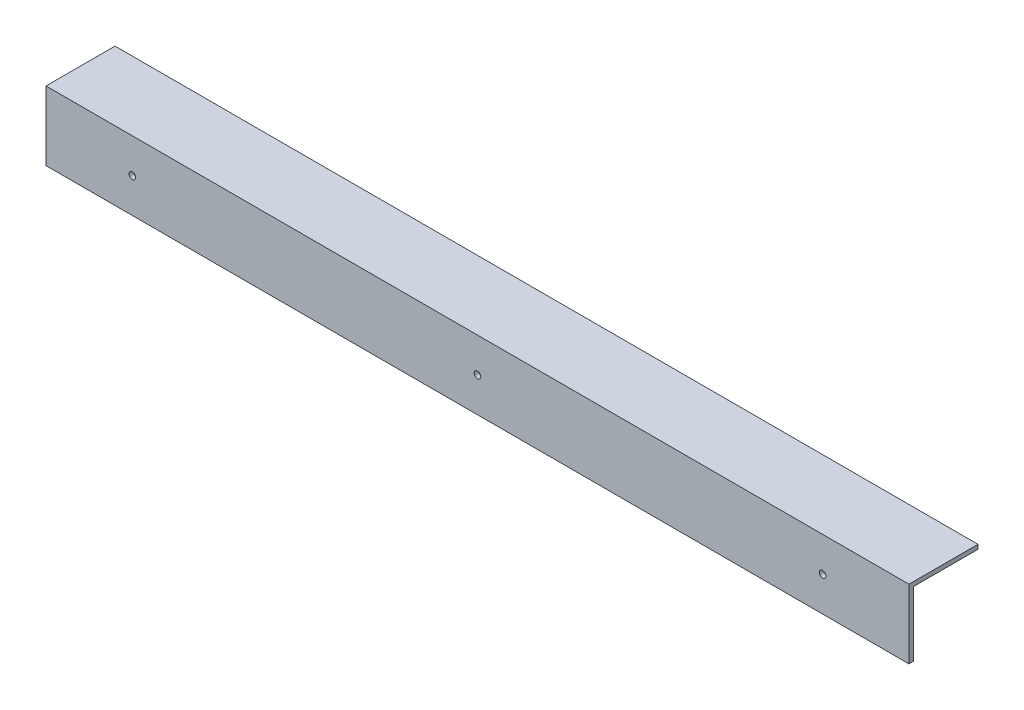
ISO-10303-21;
HEADER;
FILE_DESCRIPTION(('STEP AP214'),'2;1');
FILE_NAME('part.step','',(''),(''),'','','');
FILE_SCHEMA(('AUTOMOTIVE_DESIGN { 1 0 10303 214 1 1 1 1 }'));
ENDSEC;
DATA;
#1=APPLICATION_CONTEXT('core data for automotive mechanical design processes');
#2=APPLICATION_PROTOCOL_DEFINITION('international standard','automotive_design',2000,#1);
#3=PRODUCT_CONTEXT('',#1,'mechanical');
#4=PRODUCT('Part','Part','',(#3));
#5=PRODUCT_RELATED_PRODUCT_CATEGORY('part','',(#4));
#6=PRODUCT_DEFINITION_FORMATION('','',#4);
#7=PRODUCT_DEFINITION_CONTEXT('part definition',#1,'design');
#8=PRODUCT_DEFINITION('design','',#6,#7);
#9=PRODUCT_DEFINITION_SHAPE('','',#8);
#10=(LENGTH_UNIT() NAMED_UNIT(*) SI_UNIT(.MILLI.,.METRE.));
#11=(NAMED_UNIT(*) PLANE_ANGLE_UNIT() SI_UNIT($,.RADIAN.));
#12=(NAMED_UNIT(*) SI_UNIT($,.STERADIAN.) SOLID_ANGLE_UNIT());
#13=UNCERTAINTY_MEASURE_WITH_UNIT(LENGTH_MEASURE(1.E-05),#10,'distance_accuracy_value','');
#14=(GEOMETRIC_REPRESENTATION_CONTEXT(3) GLOBAL_UNCERTAINTY_ASSIGNED_CONTEXT((#13)) GLOBAL_UNIT_ASSIGNED_CONTEXT((#10,
#11,#12)) REPRESENTATION_CONTEXT('',''));
#15=CARTESIAN_POINT('',(0.,0.,0.));
#16=DIRECTION('',(0.,0.,1.));
#17=DIRECTION('',(1.,0.,0.));
#18=AXIS2_PLACEMENT_3D('',#15,#16,#17);
#19=CARTESIAN_POINT('',(0.,-25.4,-3.175));
#20=DIRECTION('',(0.,0.,-1.));
#21=DIRECTION('',(-1.,0.,0.));
#22=AXIS2_PLACEMENT_3D('',#19,#20,#21);
#23=CYLINDRICAL_SURFACE('',#22,2.4257);
#24=CARTESIAN_POINT('',(0.,-25.4,-3.175));
#25=DIRECTION('',(0.,0.,-1.));
#26=DIRECTION('',(-1.,0.,0.));
#27=AXIS2_PLACEMENT_3D('',#24,#25,#26);
#28=CIRCLE('',#27,2.4257);
#29=CARTESIAN_POINT('',(-2.4257,-25.4,-3.175));
#30=VERTEX_POINT('',#29);
#31=EDGE_CURVE('E19',#30,#30,#28,.F.);
#32=ORIENTED_EDGE('',*,*,#31,.F.);
#33=EDGE_LOOP('',(#32));
#34=FACE_BOUND('',#33,.T.);
#35=CARTESIAN_POINT('',(0.,-25.4,0.));
#36=DIRECTION('',(0.,0.,-1.));
#37=DIRECTION('',(-1.,0.,0.));
#38=AXIS2_PLACEMENT_3D('',#35,#36,#37);
#39=CIRCLE('',#38,2.4257);
#40=CARTESIAN_POINT('',(-2.4257,-25.4,0.));
#41=VERTEX_POINT('',#40);
#42=EDGE_CURVE('E104',#41,#41,#39,.T.);
#43=ORIENTED_EDGE('',*,*,#42,.F.);
#44=EDGE_LOOP('',(#43));
#45=FACE_BOUND('',#44,.T.);
#46=ADVANCED_FACE('F16',(#34,#45),#23,.F.);
#47=CARTESIAN_POINT('',(-254.,-25.4,-3.175));
#48=DIRECTION('',(0.,0.,-1.));
#49=DIRECTION('',(-1.,0.,0.));
#50=AXIS2_PLACEMENT_3D('',#47,#48,#49);
#51=CYLINDRICAL_SURFACE('',#50,2.4257);
#52=CARTESIAN_POINT('',(-254.,-25.4,-3.175));
#53=DIRECTION('',(0.,0.,-1.));
#54=DIRECTION('',(-1.,0.,0.));
#55=AXIS2_PLACEMENT_3D('',#52,#53,#54);
#56=CIRCLE('',#55,2.4257);
#57=CARTESIAN_POINT('',(-256.4257,-25.4,-3.175));
#58=VERTEX_POINT('',#57);
#59=EDGE_CURVE('E108',#58,#58,#56,.F.);
#60=ORIENTED_EDGE('',*,*,#59,.F.);
#61=EDGE_LOOP('',(#60));
#62=FACE_BOUND('',#61,.T.);
#63=CARTESIAN_POINT('',(-254.,-25.4,0.));
#64=DIRECTION('',(0.,0.,-1.));
#65=DIRECTION('',(-1.,0.,0.));
#66=AXIS2_PLACEMENT_3D('',#63,#64,#65);
#67=CIRCLE('',#66,2.4257);
#68=CARTESIAN_POINT('',(-256.4257,-25.4,0.));
#69=VERTEX_POINT('',#68);
#70=EDGE_CURVE('E101',#69,#69,#67,.T.);
#71=ORIENTED_EDGE('',*,*,#70,.F.);
#72=EDGE_LOOP('',(#71));
#73=FACE_BOUND('',#72,.T.);
#74=ADVANCED_FACE('F118',(#62,#73),#51,.F.);
#75=CARTESIAN_POINT('',(254.,-25.4,-3.175));
#76=DIRECTION('',(0.,0.,-1.));
#77=DIRECTION('',(-1.,0.,0.));
#78=AXIS2_PLACEMENT_3D('',#75,#76,#77);
#79=CYLINDRICAL_SURFACE('',#78,2.4257);
#80=CARTESIAN_POINT('',(254.,-25.4,-3.175));
#81=DIRECTION('',(0.,0.,-1.));
#82=DIRECTION('',(-1.,0.,0.));
#83=AXIS2_PLACEMENT_3D('',#80,#81,#82);
#84=CIRCLE('',#83,2.4257);
#85=CARTESIAN_POINT('',(251.5743,-25.4,-3.175));
#86=VERTEX_POINT('',#85);
#87=EDGE_CURVE('E95',#86,#86,#84,.F.);
#88=ORIENTED_EDGE('',*,*,#87,.F.);
#89=EDGE_LOOP('',(#88));
#90=FACE_BOUND('',#89,.T.);
#91=CARTESIAN_POINT('',(254.,-25.4,0.));
#92=DIRECTION('',(0.,0.,-1.));
#93=DIRECTION('',(-1.,0.,0.));
#94=AXIS2_PLACEMENT_3D('',#91,#92,#93);
#95=CIRCLE('',#94,2.4257);
#96=CARTESIAN_POINT('',(251.5743,-25.4,0.));
#97=VERTEX_POINT('',#96);
#98=EDGE_CURVE('E97',#97,#97,#95,.T.);
#99=ORIENTED_EDGE('',*,*,#98,.F.);
#100=EDGE_LOOP('',(#99));
#101=FACE_BOUND('',#100,.T.);
#102=ADVANCED_FACE('F226',(#90,#101),#79,.F.);
#103=CARTESIAN_POINT('',(-317.5,-50.8,0.));
#104=DIRECTION('',(0.,-1.,0.));
#105=DIRECTION('',(0.,0.,-1.));
#106=AXIS2_PLACEMENT_3D('',#103,#104,#105);
#107=PLANE('',#106);
#108=DIRECTION('',(0.,0.,-1.));
#109=VECTOR('',#108,1.);
#110=CARTESIAN_POINT('',(317.5,-50.8,0.));
#111=LINE('',#110,#109);
#112=CARTESIAN_POINT('',(317.5,-50.8,0.));
#113=VERTEX_POINT('',#112);
#114=CARTESIAN_POINT('',(317.5,-50.8,-3.175));
#115=VERTEX_POINT('',#114);
#116=EDGE_CURVE('E133',#113,#115,#111,.T.);
#117=ORIENTED_EDGE('',*,*,#116,.F.);
#118=DIRECTION('',(1.,0.,0.));
#119=VECTOR('',#118,1.);
#120=CARTESIAN_POINT('',(-317.5,-50.8,0.));
#121=LINE('',#120,#119);
#122=CARTESIAN_POINT('',(-317.5,-50.8,0.));
#123=VERTEX_POINT('',#122);
#124=EDGE_CURVE('E76',#123,#113,#121,.T.);
#125=ORIENTED_EDGE('',*,*,#124,.F.);
#126=DIRECTION('',(0.,0.,-1.));
#127=VECTOR('',#126,1.);
#128=CARTESIAN_POINT('',(-317.5,-50.8,0.));
#129=LINE('',#128,#127);
#130=CARTESIAN_POINT('',(-317.5,-50.8,-3.175));
#131=VERTEX_POINT('',#130);
#132=EDGE_CURVE('E71',#123,#131,#129,.T.);
#133=ORIENTED_EDGE('',*,*,#132,.T.);
#134=DIRECTION('',(-1.,0.,0.));
#135=VECTOR('',#134,1.);
#136=CARTESIAN_POINT('',(-317.5,-50.8,-3.175));
#137=LINE('',#136,#135);
#138=EDGE_CURVE('E74',#115,#131,#137,.T.);
#139=ORIENTED_EDGE('',*,*,#138,.F.);
#140=EDGE_LOOP('',(#117,#125,#133,#139));
#141=FACE_BOUND('',#140,.T.);
#142=ADVANCED_FACE('F73',(#141),#107,.T.);
#143=CARTESIAN_POINT('',(-317.5,-50.8,-3.175));
#144=DIRECTION('',(0.,0.,-1.));
#145=DIRECTION('',(-1.,0.,0.));
#146=AXIS2_PLACEMENT_3D('',#143,#144,#145);
#147=PLANE('',#146);
#148=ORIENTED_EDGE('',*,*,#87,.T.);
#149=EDGE_LOOP('',(#148));
#150=FACE_BOUND('',#149,.T.);
#151=ORIENTED_EDGE('',*,*,#59,.T.);
#152=EDGE_LOOP('',(#151));
#153=FACE_BOUND('',#152,.T.);
#154=ORIENTED_EDGE('',*,*,#31,.T.);
#155=EDGE_LOOP('',(#154));
#156=FACE_BOUND('',#155,.T.);
#157=DIRECTION('',(0.,1.,0.));
#158=VECTOR('',#157,1.);
#159=CARTESIAN_POINT('',(317.5,0.,-3.175));
#160=LINE('',#159,#158);
#161=CARTESIAN_POINT('',(317.5,-3.175,-3.175));
#162=VERTEX_POINT('',#161);
#163=EDGE_CURVE('E83',#115,#162,#160,.T.);
#164=ORIENTED_EDGE('',*,*,#163,.F.);
#165=ORIENTED_EDGE('',*,*,#138,.T.);
#166=DIRECTION('',(0.,1.,0.));
#167=VECTOR('',#166,1.);
#168=CARTESIAN_POINT('',(-317.5,0.,-3.175));
#169=LINE('',#168,#167);
#170=CARTESIAN_POINT('',(-317.5,-3.175,-3.175));
#171=VERTEX_POINT('',#170);
#172=EDGE_CURVE('E66',#131,#171,#169,.T.);
#173=ORIENTED_EDGE('',*,*,#172,.T.);
#174=DIRECTION('',(1.,0.,0.));
#175=VECTOR('',#174,1.);
#176=CARTESIAN_POINT('',(-317.5,-3.175,-3.175));
#177=LINE('',#176,#175);
#178=EDGE_CURVE('E79',#162,#171,#177,.F.);
#179=ORIENTED_EDGE('',*,*,#178,.F.);
#180=EDGE_LOOP('',(#164,#165,#173,#179));
#181=FACE_BOUND('',#180,.T.);
#182=ADVANCED_FACE('F81',(#150,#153,#156,#181),#147,.T.);
#183=CARTESIAN_POINT('',(-317.5,-3.175,-3.175));
#184=DIRECTION('',(0.,-1.,0.));
#185=DIRECTION('',(0.,0.,-1.));
#186=AXIS2_PLACEMENT_3D('',#183,#184,#185);
#187=PLANE('',#186);
#188=DIRECTION('',(0.,0.,-1.));
#189=VECTOR('',#188,1.);
#190=CARTESIAN_POINT('',(317.5,-3.175,0.));
#191=LINE('',#190,#189);
#192=CARTESIAN_POINT('',(317.5,-3.175,-50.8));
#193=VERTEX_POINT('',#192);
#194=EDGE_CURVE('E100',#162,#193,#191,.T.);
#195=ORIENTED_EDGE('',*,*,#194,.F.);
#196=ORIENTED_EDGE('',*,*,#178,.T.);
#197=DIRECTION('',(0.,0.,-1.));
#198=VECTOR('',#197,1.);
#199=CARTESIAN_POINT('',(-317.5,-3.175,0.));
#200=LINE('',#199,#198);
#201=CARTESIAN_POINT('',(-317.5,-3.175,-50.8));
#202=VERTEX_POINT('',#201);
#203=EDGE_CURVE('E89',#171,#202,#200,.T.);
#204=ORIENTED_EDGE('',*,*,#203,.T.);
#205=DIRECTION('',(-1.,0.,0.));
#206=VECTOR('',#205,1.);
#207=CARTESIAN_POINT('',(-317.5,-3.175,-50.8));
#208=LINE('',#207,#206);
#209=EDGE_CURVE('E141',#193,#202,#208,.T.);
#210=ORIENTED_EDGE('',*,*,#209,.F.);
#211=EDGE_LOOP('',(#195,#196,#204,#210));
#212=FACE_BOUND('',#211,.T.);
#213=ADVANCED_FACE('F158',(#212),#187,.T.);
#214=CARTESIAN_POINT('',(-317.5,0.,0.));
#215=DIRECTION('',(1.,0.,0.));
#216=DIRECTION('',(0.,0.,-1.));
#217=AXIS2_PLACEMENT_3D('',#214,#215,#216);
#218=PLANE('',#217);
#219=ORIENTED_EDGE('',*,*,#172,.F.);
#220=ORIENTED_EDGE('',*,*,#132,.F.);
#221=DIRECTION('',(0.,1.,0.));
#222=VECTOR('',#221,1.);
#223=CARTESIAN_POINT('',(-317.5,0.,0.));
#224=LINE('',#223,#222);
#225=CARTESIAN_POINT('',(-317.5,0.,0.));
#226=VERTEX_POINT('',#225);
#227=EDGE_CURVE('E91',#226,#123,#224,.F.);
#228=ORIENTED_EDGE('',*,*,#227,.F.);
#229=DIRECTION('',(0.,0.,1.));
#230=VECTOR('',#229,1.);
#231=CARTESIAN_POINT('',(-317.5,0.,-50.8));
#232=LINE('',#231,#230);
#233=CARTESIAN_POINT('',(-317.5,0.,-50.8));
#234=VERTEX_POINT('',#233);
#235=EDGE_CURVE('E139',#234,#226,#232,.T.);
#236=ORIENTED_EDGE('',*,*,#235,.F.);
#237=DIRECTION('',(0.,1.,0.));
#238=VECTOR('',#237,1.);
#239=CARTESIAN_POINT('',(-317.5,-3.175,-50.8));
#240=LINE('',#239,#238);
#241=EDGE_CURVE('E147',#202,#234,#240,.T.);
#242=ORIENTED_EDGE('',*,*,#241,.F.);
#243=ORIENTED_EDGE('',*,*,#203,.F.);
#244=EDGE_LOOP('',(#219,#220,#228,#236,#242,#243));
#245=FACE_BOUND('',#244,.T.);
#246=ADVANCED_FACE('F87',(#245),#218,.F.);
#247=CARTESIAN_POINT('',(-317.5,0.,0.));
#248=DIRECTION('',(0.,0.,1.));
#249=DIRECTION('',(1.,0.,0.));
#250=AXIS2_PLACEMENT_3D('',#247,#248,#249);
#251=PLANE('',#250);
#252=ORIENTED_EDGE('',*,*,#98,.T.);
#253=EDGE_LOOP('',(#252));
#254=FACE_BOUND('',#253,.T.);
#255=ORIENTED_EDGE('',*,*,#70,.T.);
#256=EDGE_LOOP('',(#255));
#257=FACE_BOUND('',#256,.T.);
#258=ORIENTED_EDGE('',*,*,#42,.T.);
#259=EDGE_LOOP('',(#258));
#260=FACE_BOUND('',#259,.T.);
#261=DIRECTION('',(0.,1.,0.));
#262=VECTOR('',#261,1.);
#263=CARTESIAN_POINT('',(317.5,0.,0.));
#264=LINE('',#263,#262);
#265=CARTESIAN_POINT('',(317.5,0.,0.));
#266=VERTEX_POINT('',#265);
#267=EDGE_CURVE('E129',#266,#113,#264,.F.);
#268=ORIENTED_EDGE('',*,*,#267,.F.);
#269=DIRECTION('',(1.,0.,0.));
#270=VECTOR('',#269,1.);
#271=CARTESIAN_POINT('',(-317.5,0.,0.));
#272=LINE('',#271,#270);
#273=EDGE_CURVE('E131',#226,#266,#272,.T.);
#274=ORIENTED_EDGE('',*,*,#273,.F.);
#275=ORIENTED_EDGE('',*,*,#227,.T.);
#276=ORIENTED_EDGE('',*,*,#124,.T.);
#277=EDGE_LOOP('',(#268,#274,#275,#276));
#278=FACE_BOUND('',#277,.T.);
#279=ADVANCED_FACE('F121',(#254,#257,#260,#278),#251,.T.);
#280=CARTESIAN_POINT('',(317.5,0.,0.));
#281=DIRECTION('',(1.,0.,0.));
#282=DIRECTION('',(0.,0.,-1.));
#283=AXIS2_PLACEMENT_3D('',#280,#281,#282);
#284=PLANE('',#283);
#285=ORIENTED_EDGE('',*,*,#116,.T.);
#286=ORIENTED_EDGE('',*,*,#163,.T.);
#287=ORIENTED_EDGE('',*,*,#194,.T.);
#288=DIRECTION('',(0.,1.,0.));
#289=VECTOR('',#288,1.);
#290=CARTESIAN_POINT('',(317.5,-3.175,-50.8));
#291=LINE('',#290,#289);
#292=CARTESIAN_POINT('',(317.5,0.,-50.8));
#293=VERTEX_POINT('',#292);
#294=EDGE_CURVE('E34',#293,#193,#291,.F.);
#295=ORIENTED_EDGE('',*,*,#294,.F.);
#296=DIRECTION('',(0.,0.,1.));
#297=VECTOR('',#296,1.);
#298=CARTESIAN_POINT('',(317.5,0.,-50.8));
#299=LINE('',#298,#297);
#300=EDGE_CURVE('E25',#266,#293,#299,.F.);
#301=ORIENTED_EDGE('',*,*,#300,.F.);
#302=ORIENTED_EDGE('',*,*,#267,.T.);
#303=EDGE_LOOP('',(#285,#286,#287,#295,#301,#302));
#304=FACE_BOUND('',#303,.T.);
#305=ADVANCED_FACE('F124',(#304),#284,.T.);
#306=CARTESIAN_POINT('',(-317.5,-3.175,-50.8));
#307=DIRECTION('',(0.,0.,-1.));
#308=DIRECTION('',(-1.,0.,0.));
#309=AXIS2_PLACEMENT_3D('',#306,#307,#308);
#310=PLANE('',#309);
#311=ORIENTED_EDGE('',*,*,#294,.T.);
#312=ORIENTED_EDGE('',*,*,#209,.T.);
#313=ORIENTED_EDGE('',*,*,#241,.T.);
#314=DIRECTION('',(1.,0.,0.));
#315=VECTOR('',#314,1.);
#316=CARTESIAN_POINT('',(-317.5,0.,-50.8));
#317=LINE('',#316,#315);
#318=EDGE_CURVE('E11',#293,#234,#317,.F.);
#319=ORIENTED_EDGE('',*,*,#318,.F.);
#320=EDGE_LOOP('',(#311,#312,#313,#319));
#321=FACE_BOUND('',#320,.T.);
#322=ADVANCED_FACE('F154',(#321),#310,.T.);
#323=CARTESIAN_POINT('',(-317.5,0.,-50.8));
#324=DIRECTION('',(0.,1.,0.));
#325=DIRECTION('',(0.,0.,1.));
#326=AXIS2_PLACEMENT_3D('',#323,#324,#325);
#327=PLANE('',#326);
#328=ORIENTED_EDGE('',*,*,#300,.T.);
#329=ORIENTED_EDGE('',*,*,#318,.T.);
#330=ORIENTED_EDGE('',*,*,#235,.T.);
#331=ORIENTED_EDGE('',*,*,#273,.T.);
#332=EDGE_LOOP('',(#328,#329,#330,#331));
#333=FACE_BOUND('',#332,.T.);
#334=ADVANCED_FACE('F138',(#333),#327,.T.);
#335=CLOSED_SHELL('',(#46,#74,#102,#142,#182,#213,#246,#279,#305,#322,#334));
#336=MANIFOLD_SOLID_BREP('B1',#335);
#337=ADVANCED_BREP_SHAPE_REPRESENTATION('',(#18,#336),#14);
#338=SHAPE_DEFINITION_REPRESENTATION(#9,#337);
ENDSEC;
END-ISO-10303-21;
